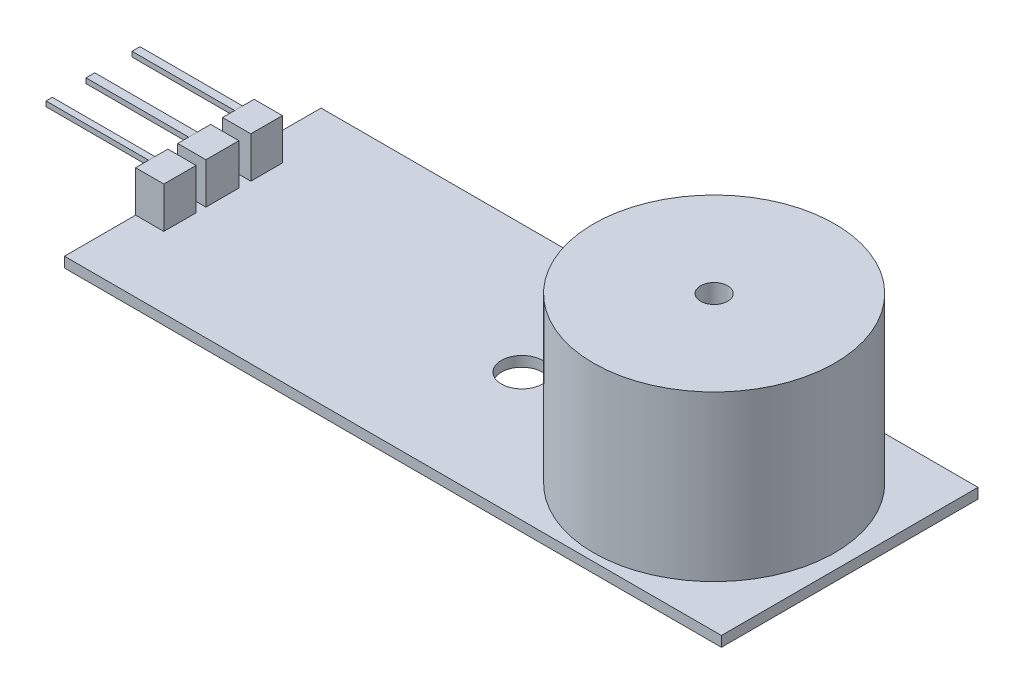
ISO-10303-21;
HEADER;
FILE_DESCRIPTION(('STEP AP214'),'2;1');
FILE_NAME('part.step','',(''),(''),'','','');
FILE_SCHEMA(('AUTOMOTIVE_DESIGN { 1 0 10303 214 1 1 1 1 }'));
ENDSEC;
DATA;
#1=APPLICATION_CONTEXT('core data for automotive mechanical design processes');
#2=APPLICATION_PROTOCOL_DEFINITION('international standard','automotive_design',2000,#1);
#3=PRODUCT_CONTEXT('',#1,'mechanical');
#4=PRODUCT('Part','Part','',(#3));
#5=PRODUCT_RELATED_PRODUCT_CATEGORY('part','',(#4));
#6=PRODUCT_DEFINITION_FORMATION('','',#4);
#7=PRODUCT_DEFINITION_CONTEXT('part definition',#1,'design');
#8=PRODUCT_DEFINITION('design','',#6,#7);
#9=PRODUCT_DEFINITION_SHAPE('','',#8);
#10=(LENGTH_UNIT() NAMED_UNIT(*) SI_UNIT(.MILLI.,.METRE.));
#11=(NAMED_UNIT(*) PLANE_ANGLE_UNIT() SI_UNIT($,.RADIAN.));
#12=(NAMED_UNIT(*) SI_UNIT($,.STERADIAN.) SOLID_ANGLE_UNIT());
#13=UNCERTAINTY_MEASURE_WITH_UNIT(LENGTH_MEASURE(1.E-05),#10,'distance_accuracy_value','');
#14=(GEOMETRIC_REPRESENTATION_CONTEXT(3) GLOBAL_UNCERTAINTY_ASSIGNED_CONTEXT((#13)) GLOBAL_UNIT_ASSIGNED_CONTEXT((#10,
#11,#12)) REPRESENTATION_CONTEXT('',''));
#15=CARTESIAN_POINT('',(0.,0.,0.));
#16=DIRECTION('',(0.,0.,1.));
#17=DIRECTION('',(1.,0.,0.));
#18=AXIS2_PLACEMENT_3D('',#15,#16,#17);
#19=CARTESIAN_POINT('',(-5.,2.5,-4.40804590340399));
#20=DIRECTION('',(0.,0.,1.));
#21=DIRECTION('',(1.,0.,0.));
#22=AXIS2_PLACEMENT_3D('',#19,#20,#21);
#23=PLANE('',#22);
#24=DIRECTION('',(0.,-1.,0.));
#25=VECTOR('',#24,1.);
#26=CARTESIAN_POINT('',(0.,2.5,-4.40804590340399));
#27=LINE('',#26,#25);
#28=CARTESIAN_POINT('',(0.,2.5,-4.40804590340399));
#29=VERTEX_POINT('',#28);
#30=CARTESIAN_POINT('',(0.,2.25454972868777,-4.40804590340399));
#31=VERTEX_POINT('',#30);
#32=EDGE_CURVE('E108',#29,#31,#27,.T.);
#33=ORIENTED_EDGE('',*,*,#32,.T.);
#34=DIRECTION('',(1.,0.,0.));
#35=VECTOR('',#34,1.);
#36=CARTESIAN_POINT('',(-5.,2.25454972868777,-4.40804590340399));
#37=LINE('',#36,#35);
#38=CARTESIAN_POINT('',(-5.,2.25454972868777,-4.40804590340399));
#39=VERTEX_POINT('',#38);
#40=EDGE_CURVE('E12',#39,#31,#37,.T.);
#41=ORIENTED_EDGE('',*,*,#40,.F.);
#42=DIRECTION('',(0.,-1.,0.));
#43=VECTOR('',#42,1.);
#44=CARTESIAN_POINT('',(-5.,2.5,-4.40804590340399));
#45=LINE('',#44,#43);
#46=CARTESIAN_POINT('',(-5.,2.5,-4.40804590340399));
#47=VERTEX_POINT('',#46);
#48=EDGE_CURVE('E96',#47,#39,#45,.T.);
#49=ORIENTED_EDGE('',*,*,#48,.F.);
#50=DIRECTION('',(1.,0.,0.));
#51=VECTOR('',#50,1.);
#52=CARTESIAN_POINT('',(-5.,2.5,-4.40804590340399));
#53=LINE('',#52,#51);
#54=EDGE_CURVE('E104',#47,#29,#53,.T.);
#55=ORIENTED_EDGE('',*,*,#54,.T.);
#56=EDGE_LOOP('',(#33,#41,#49,#55));
#57=FACE_BOUND('',#56,.T.);
#58=ADVANCED_FACE('F45',(#57),#23,.F.);
#59=CARTESIAN_POINT('',(-5.,2.25454972868777,-4.40804590340399));
#60=DIRECTION('',(0.,1.,0.));
#61=DIRECTION('',(0.,0.,1.));
#62=AXIS2_PLACEMENT_3D('',#59,#60,#61);
#63=PLANE('',#62);
#64=DIRECTION('',(0.,0.,1.));
#65=VECTOR('',#64,1.);
#66=CARTESIAN_POINT('',(0.,2.25454972868777,-4.40804590340399));
#67=LINE('',#66,#65);
#68=CARTESIAN_POINT('',(0.,2.25454972868777,-4.10105355397133));
#69=VERTEX_POINT('',#68);
#70=EDGE_CURVE('E100',#31,#69,#67,.T.);
#71=ORIENTED_EDGE('',*,*,#70,.T.);
#72=DIRECTION('',(1.,0.,0.));
#73=VECTOR('',#72,1.);
#74=CARTESIAN_POINT('',(-5.,2.25454972868777,-4.10105355397133));
#75=LINE('',#74,#73);
#76=CARTESIAN_POINT('',(-5.,2.25454972868777,-4.10105355397133));
#77=VERTEX_POINT('',#76);
#78=EDGE_CURVE('E53',#77,#69,#75,.T.);
#79=ORIENTED_EDGE('',*,*,#78,.F.);
#80=DIRECTION('',(0.,0.,1.));
#81=VECTOR('',#80,1.);
#82=CARTESIAN_POINT('',(-5.,2.25454972868777,-4.40804590340399));
#83=LINE('',#82,#81);
#84=EDGE_CURVE('E91',#39,#77,#83,.T.);
#85=ORIENTED_EDGE('',*,*,#84,.F.);
#86=ORIENTED_EDGE('',*,*,#40,.T.);
#87=EDGE_LOOP('',(#71,#79,#85,#86));
#88=FACE_BOUND('',#87,.T.);
#89=ADVANCED_FACE('F99',(#88),#63,.F.);
#90=CARTESIAN_POINT('',(-5.,2.5,-4.10105355397133));
#91=DIRECTION('',(0.,0.,-1.));
#92=DIRECTION('',(-1.,0.,0.));
#93=AXIS2_PLACEMENT_3D('',#90,#91,#92);
#94=PLANE('',#93);
#95=DIRECTION('',(0.,1.,0.));
#96=VECTOR('',#95,1.);
#97=CARTESIAN_POINT('',(0.,2.5,-4.10105355397133));
#98=LINE('',#97,#96);
#99=CARTESIAN_POINT('',(0.,2.5,-4.10105355397133));
#100=VERTEX_POINT('',#99);
#101=EDGE_CURVE('E78',#69,#100,#98,.T.);
#102=ORIENTED_EDGE('',*,*,#101,.T.);
#103=DIRECTION('',(1.,0.,0.));
#104=VECTOR('',#103,1.);
#105=CARTESIAN_POINT('',(-5.,2.5,-4.10105355397133));
#106=LINE('',#105,#104);
#107=CARTESIAN_POINT('',(-5.,2.5,-4.10105355397133));
#108=VERTEX_POINT('',#107);
#109=EDGE_CURVE('E101',#108,#100,#106,.T.);
#110=ORIENTED_EDGE('',*,*,#109,.F.);
#111=DIRECTION('',(0.,1.,0.));
#112=VECTOR('',#111,1.);
#113=CARTESIAN_POINT('',(-5.,2.5,-4.10105355397133));
#114=LINE('',#113,#112);
#115=EDGE_CURVE('E94',#77,#108,#114,.T.);
#116=ORIENTED_EDGE('',*,*,#115,.F.);
#117=ORIENTED_EDGE('',*,*,#78,.T.);
#118=EDGE_LOOP('',(#102,#110,#116,#117));
#119=FACE_BOUND('',#118,.T.);
#120=ADVANCED_FACE('F102',(#119),#94,.F.);
#121=CARTESIAN_POINT('',(-5.,2.5,-4.40804590340399));
#122=DIRECTION('',(0.,-1.,0.));
#123=DIRECTION('',(0.,0.,-1.));
#124=AXIS2_PLACEMENT_3D('',#121,#122,#123);
#125=PLANE('',#124);
#126=DIRECTION('',(0.,0.,-1.));
#127=VECTOR('',#126,1.);
#128=CARTESIAN_POINT('',(0.,2.5,-4.40804590340399));
#129=LINE('',#128,#127);
#130=EDGE_CURVE('E84',#100,#29,#129,.T.);
#131=ORIENTED_EDGE('',*,*,#130,.T.);
#132=ORIENTED_EDGE('',*,*,#54,.F.);
#133=DIRECTION('',(0.,0.,-1.));
#134=VECTOR('',#133,1.);
#135=CARTESIAN_POINT('',(-5.,2.5,-4.40804590340399));
#136=LINE('',#135,#134);
#137=EDGE_CURVE('E61',#108,#47,#136,.T.);
#138=ORIENTED_EDGE('',*,*,#137,.F.);
#139=ORIENTED_EDGE('',*,*,#109,.T.);
#140=EDGE_LOOP('',(#131,#132,#138,#139));
#141=FACE_BOUND('',#140,.T.);
#142=ADVANCED_FACE('F115',(#141),#125,.F.);
#143=CARTESIAN_POINT('',(-5.,0.,0.));
#144=DIRECTION('',(-1.,0.,0.));
#145=DIRECTION('',(0.,0.,1.));
#146=AXIS2_PLACEMENT_3D('',#143,#144,#145);
#147=PLANE('',#146);
#148=ORIENTED_EDGE('',*,*,#48,.T.);
#149=ORIENTED_EDGE('',*,*,#84,.T.);
#150=ORIENTED_EDGE('',*,*,#115,.T.);
#151=ORIENTED_EDGE('',*,*,#137,.T.);
#152=EDGE_LOOP('',(#148,#149,#150,#151));
#153=FACE_BOUND('',#152,.T.);
#154=ADVANCED_FACE('F92',(#153),#147,.T.);
#155=CARTESIAN_POINT('',(0.,0.,0.));
#156=DIRECTION('',(-1.,0.,0.));
#157=DIRECTION('',(0.,0.,1.));
#158=AXIS2_PLACEMENT_3D('',#155,#156,#157);
#159=PLANE('',#158);
#160=ORIENTED_EDGE('',*,*,#32,.F.);
#161=ORIENTED_EDGE('',*,*,#130,.F.);
#162=ORIENTED_EDGE('',*,*,#101,.F.);
#163=ORIENTED_EDGE('',*,*,#70,.F.);
#164=EDGE_LOOP('',(#160,#161,#162,#163));
#165=FACE_BOUND('',#164,.T.);
#166=ADVANCED_FACE('F118',(#165),#159,.F.);
#167=CLOSED_SHELL('',(#58,#89,#120,#142,#154,#166));
#168=MANIFOLD_SOLID_BREP('B2',#167);
#169=CARTESIAN_POINT('',(-5.,2.5,-6.4769073887111));
#170=DIRECTION('',(0.,0.,1.));
#171=DIRECTION('',(1.,0.,0.));
#172=AXIS2_PLACEMENT_3D('',#169,#170,#171);
#173=PLANE('',#172);
#174=DIRECTION('',(0.,-1.,0.));
#175=VECTOR('',#174,1.);
#176=CARTESIAN_POINT('',(0.,2.5,-6.4769073887111));
#177=LINE('',#176,#175);
#178=CARTESIAN_POINT('',(0.,2.5,-6.4769073887111));
#179=VERTEX_POINT('',#178);
#180=CARTESIAN_POINT('',(0.,2.25454972868777,-6.4769073887111));
#181=VERTEX_POINT('',#180);
#182=EDGE_CURVE('E241',#179,#181,#177,.T.);
#183=ORIENTED_EDGE('',*,*,#182,.T.);
#184=DIRECTION('',(1.,0.,0.));
#185=VECTOR('',#184,1.);
#186=CARTESIAN_POINT('',(-5.,2.25454972868777,-6.4769073887111));
#187=LINE('',#186,#185);
#188=CARTESIAN_POINT('',(-5.,2.25454972868777,-6.4769073887111));
#189=VERTEX_POINT('',#188);
#190=EDGE_CURVE('E43',#189,#181,#187,.T.);
#191=ORIENTED_EDGE('',*,*,#190,.F.);
#192=DIRECTION('',(0.,-1.,0.));
#193=VECTOR('',#192,1.);
#194=CARTESIAN_POINT('',(-5.,2.5,-6.4769073887111));
#195=LINE('',#194,#193);
#196=CARTESIAN_POINT('',(-5.,2.5,-6.4769073887111));
#197=VERTEX_POINT('',#196);
#198=EDGE_CURVE('E229',#197,#189,#195,.T.);
#199=ORIENTED_EDGE('',*,*,#198,.F.);
#200=DIRECTION('',(1.,0.,0.));
#201=VECTOR('',#200,1.);
#202=CARTESIAN_POINT('',(-5.,2.5,-6.4769073887111));
#203=LINE('',#202,#201);
#204=EDGE_CURVE('E237',#197,#179,#203,.T.);
#205=ORIENTED_EDGE('',*,*,#204,.T.);
#206=EDGE_LOOP('',(#183,#191,#199,#205));
#207=FACE_BOUND('',#206,.T.);
#208=ADVANCED_FACE('F178',(#207),#173,.F.);
#209=CARTESIAN_POINT('',(-5.,2.25454972868777,-6.4769073887111));
#210=DIRECTION('',(0.,1.,0.));
#211=DIRECTION('',(0.,0.,1.));
#212=AXIS2_PLACEMENT_3D('',#209,#210,#211);
#213=PLANE('',#212);
#214=DIRECTION('',(0.,0.,1.));
#215=VECTOR('',#214,1.);
#216=CARTESIAN_POINT('',(0.,2.25454972868777,-6.4769073887111));
#217=LINE('',#216,#215);
#218=CARTESIAN_POINT('',(0.,2.25454972868777,-6.04978759819609));
#219=VERTEX_POINT('',#218);
#220=EDGE_CURVE('E233',#181,#219,#217,.T.);
#221=ORIENTED_EDGE('',*,*,#220,.T.);
#222=DIRECTION('',(1.,0.,0.));
#223=VECTOR('',#222,1.);
#224=CARTESIAN_POINT('',(-5.,2.25454972868777,-6.04978759819609));
#225=LINE('',#224,#223);
#226=CARTESIAN_POINT('',(-5.,2.25454972868777,-6.04978759819609));
#227=VERTEX_POINT('',#226);
#228=EDGE_CURVE('E186',#227,#219,#225,.T.);
#229=ORIENTED_EDGE('',*,*,#228,.F.);
#230=DIRECTION('',(0.,0.,1.));
#231=VECTOR('',#230,1.);
#232=CARTESIAN_POINT('',(-5.,2.25454972868777,-6.4769073887111));
#233=LINE('',#232,#231);
#234=EDGE_CURVE('E224',#189,#227,#233,.T.);
#235=ORIENTED_EDGE('',*,*,#234,.F.);
#236=ORIENTED_EDGE('',*,*,#190,.T.);
#237=EDGE_LOOP('',(#221,#229,#235,#236));
#238=FACE_BOUND('',#237,.T.);
#239=ADVANCED_FACE('F232',(#238),#213,.F.);
#240=CARTESIAN_POINT('',(-5.,2.5,-6.04978759819609));
#241=DIRECTION('',(0.,0.,-1.));
#242=DIRECTION('',(-1.,0.,0.));
#243=AXIS2_PLACEMENT_3D('',#240,#241,#242);
#244=PLANE('',#243);
#245=DIRECTION('',(0.,1.,0.));
#246=VECTOR('',#245,1.);
#247=CARTESIAN_POINT('',(0.,2.5,-6.04978759819609));
#248=LINE('',#247,#246);
#249=CARTESIAN_POINT('',(0.,2.5,-6.04978759819609));
#250=VERTEX_POINT('',#249);
#251=EDGE_CURVE('E211',#219,#250,#248,.T.);
#252=ORIENTED_EDGE('',*,*,#251,.T.);
#253=DIRECTION('',(1.,0.,0.));
#254=VECTOR('',#253,1.);
#255=CARTESIAN_POINT('',(-5.,2.5,-6.04978759819609));
#256=LINE('',#255,#254);
#257=CARTESIAN_POINT('',(-5.,2.5,-6.04978759819609));
#258=VERTEX_POINT('',#257);
#259=EDGE_CURVE('E234',#258,#250,#256,.T.);
#260=ORIENTED_EDGE('',*,*,#259,.F.);
#261=DIRECTION('',(0.,1.,0.));
#262=VECTOR('',#261,1.);
#263=CARTESIAN_POINT('',(-5.,2.5,-6.04978759819609));
#264=LINE('',#263,#262);
#265=EDGE_CURVE('E227',#227,#258,#264,.T.);
#266=ORIENTED_EDGE('',*,*,#265,.F.);
#267=ORIENTED_EDGE('',*,*,#228,.T.);
#268=EDGE_LOOP('',(#252,#260,#266,#267));
#269=FACE_BOUND('',#268,.T.);
#270=ADVANCED_FACE('F235',(#269),#244,.F.);
#271=CARTESIAN_POINT('',(-5.,2.5,-6.4769073887111));
#272=DIRECTION('',(0.,-1.,0.));
#273=DIRECTION('',(0.,0.,-1.));
#274=AXIS2_PLACEMENT_3D('',#271,#272,#273);
#275=PLANE('',#274);
#276=DIRECTION('',(0.,0.,-1.));
#277=VECTOR('',#276,1.);
#278=CARTESIAN_POINT('',(0.,2.5,-6.4769073887111));
#279=LINE('',#278,#277);
#280=EDGE_CURVE('E217',#250,#179,#279,.T.);
#281=ORIENTED_EDGE('',*,*,#280,.T.);
#282=ORIENTED_EDGE('',*,*,#204,.F.);
#283=DIRECTION('',(0.,0.,-1.));
#284=VECTOR('',#283,1.);
#285=CARTESIAN_POINT('',(-5.,2.5,-6.4769073887111));
#286=LINE('',#285,#284);
#287=EDGE_CURVE('E194',#258,#197,#286,.T.);
#288=ORIENTED_EDGE('',*,*,#287,.F.);
#289=ORIENTED_EDGE('',*,*,#259,.T.);
#290=EDGE_LOOP('',(#281,#282,#288,#289));
#291=FACE_BOUND('',#290,.T.);
#292=ADVANCED_FACE('F248',(#291),#275,.F.);
#293=CARTESIAN_POINT('',(-5.,0.,0.));
#294=DIRECTION('',(-1.,0.,0.));
#295=DIRECTION('',(0.,0.,1.));
#296=AXIS2_PLACEMENT_3D('',#293,#294,#295);
#297=PLANE('',#296);
#298=ORIENTED_EDGE('',*,*,#198,.T.);
#299=ORIENTED_EDGE('',*,*,#234,.T.);
#300=ORIENTED_EDGE('',*,*,#265,.T.);
#301=ORIENTED_EDGE('',*,*,#287,.T.);
#302=EDGE_LOOP('',(#298,#299,#300,#301));
#303=FACE_BOUND('',#302,.T.);
#304=ADVANCED_FACE('F225',(#303),#297,.T.);
#305=CARTESIAN_POINT('',(0.,0.,0.));
#306=DIRECTION('',(-1.,0.,0.));
#307=DIRECTION('',(0.,0.,1.));
#308=AXIS2_PLACEMENT_3D('',#305,#306,#307);
#309=PLANE('',#308);
#310=ORIENTED_EDGE('',*,*,#182,.F.);
#311=ORIENTED_EDGE('',*,*,#280,.F.);
#312=ORIENTED_EDGE('',*,*,#251,.F.);
#313=ORIENTED_EDGE('',*,*,#220,.F.);
#314=EDGE_LOOP('',(#310,#311,#312,#313));
#315=FACE_BOUND('',#314,.T.);
#316=ADVANCED_FACE('F251',(#315),#309,.F.);
#317=CLOSED_SHELL('',(#208,#239,#270,#292,#304,#316));
#318=MANIFOLD_SOLID_BREP('B6',#317);
#319=CARTESIAN_POINT('',(-5.,2.5,-8.67924380855415));
#320=DIRECTION('',(0.,0.,1.));
#321=DIRECTION('',(1.,0.,0.));
#322=AXIS2_PLACEMENT_3D('',#319,#320,#321);
#323=PLANE('',#322);
#324=DIRECTION('',(0.,-1.,0.));
#325=VECTOR('',#324,1.);
#326=CARTESIAN_POINT('',(0.,2.5,-8.67924380855415));
#327=LINE('',#326,#325);
#328=CARTESIAN_POINT('',(0.,2.5,-8.67924380855415));
#329=VERTEX_POINT('',#328);
#330=CARTESIAN_POINT('',(0.,2.25454972868777,-8.67924380855415));
#331=VERTEX_POINT('',#330);
#332=EDGE_CURVE('E374',#329,#331,#327,.T.);
#333=ORIENTED_EDGE('',*,*,#332,.T.);
#334=DIRECTION('',(1.,0.,0.));
#335=VECTOR('',#334,1.);
#336=CARTESIAN_POINT('',(-5.,2.25454972868777,-8.67924380855415));
#337=LINE('',#336,#335);
#338=CARTESIAN_POINT('',(-5.,2.25454972868777,-8.67924380855415));
#339=VERTEX_POINT('',#338);
#340=EDGE_CURVE('E176',#339,#331,#337,.T.);
#341=ORIENTED_EDGE('',*,*,#340,.F.);
#342=DIRECTION('',(0.,-1.,0.));
#343=VECTOR('',#342,1.);
#344=CARTESIAN_POINT('',(-5.,2.5,-8.67924380855415));
#345=LINE('',#344,#343);
#346=CARTESIAN_POINT('',(-5.,2.5,-8.67924380855415));
#347=VERTEX_POINT('',#346);
#348=EDGE_CURVE('E362',#347,#339,#345,.T.);
#349=ORIENTED_EDGE('',*,*,#348,.F.);
#350=DIRECTION('',(1.,0.,0.));
#351=VECTOR('',#350,1.);
#352=CARTESIAN_POINT('',(-5.,2.5,-8.67924380855415));
#353=LINE('',#352,#351);
#354=EDGE_CURVE('E370',#347,#329,#353,.T.);
#355=ORIENTED_EDGE('',*,*,#354,.T.);
#356=EDGE_LOOP('',(#333,#341,#349,#355));
#357=FACE_BOUND('',#356,.T.);
#358=ADVANCED_FACE('F311',(#357),#323,.F.);
#359=CARTESIAN_POINT('',(-5.,2.25454972868777,-8.67924380855415));
#360=DIRECTION('',(0.,1.,0.));
#361=DIRECTION('',(0.,0.,1.));
#362=AXIS2_PLACEMENT_3D('',#359,#360,#361);
#363=PLANE('',#362);
#364=DIRECTION('',(0.,0.,1.));
#365=VECTOR('',#364,1.);
#366=CARTESIAN_POINT('',(0.,2.25454972868777,-8.67924380855415));
#367=LINE('',#366,#365);
#368=CARTESIAN_POINT('',(0.,2.25454972868777,-8.29216649839992));
#369=VERTEX_POINT('',#368);
#370=EDGE_CURVE('E366',#331,#369,#367,.T.);
#371=ORIENTED_EDGE('',*,*,#370,.T.);
#372=DIRECTION('',(1.,0.,0.));
#373=VECTOR('',#372,1.);
#374=CARTESIAN_POINT('',(-5.,2.25454972868777,-8.29216649839992));
#375=LINE('',#374,#373);
#376=CARTESIAN_POINT('',(-5.,2.25454972868777,-8.29216649839992));
#377=VERTEX_POINT('',#376);
#378=EDGE_CURVE('E319',#377,#369,#375,.T.);
#379=ORIENTED_EDGE('',*,*,#378,.F.);
#380=DIRECTION('',(0.,0.,1.));
#381=VECTOR('',#380,1.);
#382=CARTESIAN_POINT('',(-5.,2.25454972868777,-8.67924380855415));
#383=LINE('',#382,#381);
#384=EDGE_CURVE('E357',#339,#377,#383,.T.);
#385=ORIENTED_EDGE('',*,*,#384,.F.);
#386=ORIENTED_EDGE('',*,*,#340,.T.);
#387=EDGE_LOOP('',(#371,#379,#385,#386));
#388=FACE_BOUND('',#387,.T.);
#389=ADVANCED_FACE('F365',(#388),#363,.F.);
#390=CARTESIAN_POINT('',(-5.,2.5,-8.29216649839992));
#391=DIRECTION('',(0.,0.,-1.));
#392=DIRECTION('',(-1.,0.,0.));
#393=AXIS2_PLACEMENT_3D('',#390,#391,#392);
#394=PLANE('',#393);
#395=DIRECTION('',(0.,1.,0.));
#396=VECTOR('',#395,1.);
#397=CARTESIAN_POINT('',(0.,2.5,-8.29216649839992));
#398=LINE('',#397,#396);
#399=CARTESIAN_POINT('',(0.,2.5,-8.29216649839992));
#400=VERTEX_POINT('',#399);
#401=EDGE_CURVE('E344',#369,#400,#398,.T.);
#402=ORIENTED_EDGE('',*,*,#401,.T.);
#403=DIRECTION('',(1.,0.,0.));
#404=VECTOR('',#403,1.);
#405=CARTESIAN_POINT('',(-5.,2.5,-8.29216649839992));
#406=LINE('',#405,#404);
#407=CARTESIAN_POINT('',(-5.,2.5,-8.29216649839992));
#408=VERTEX_POINT('',#407);
#409=EDGE_CURVE('E367',#408,#400,#406,.T.);
#410=ORIENTED_EDGE('',*,*,#409,.F.);
#411=DIRECTION('',(0.,1.,0.));
#412=VECTOR('',#411,1.);
#413=CARTESIAN_POINT('',(-5.,2.5,-8.29216649839992));
#414=LINE('',#413,#412);
#415=EDGE_CURVE('E360',#377,#408,#414,.T.);
#416=ORIENTED_EDGE('',*,*,#415,.F.);
#417=ORIENTED_EDGE('',*,*,#378,.T.);
#418=EDGE_LOOP('',(#402,#410,#416,#417));
#419=FACE_BOUND('',#418,.T.);
#420=ADVANCED_FACE('F368',(#419),#394,.F.);
#421=CARTESIAN_POINT('',(-5.,2.5,-8.67924380855415));
#422=DIRECTION('',(0.,-1.,0.));
#423=DIRECTION('',(0.,0.,-1.));
#424=AXIS2_PLACEMENT_3D('',#421,#422,#423);
#425=PLANE('',#424);
#426=DIRECTION('',(0.,0.,-1.));
#427=VECTOR('',#426,1.);
#428=CARTESIAN_POINT('',(0.,2.5,-8.67924380855415));
#429=LINE('',#428,#427);
#430=EDGE_CURVE('E350',#400,#329,#429,.T.);
#431=ORIENTED_EDGE('',*,*,#430,.T.);
#432=ORIENTED_EDGE('',*,*,#354,.F.);
#433=DIRECTION('',(0.,0.,-1.));
#434=VECTOR('',#433,1.);
#435=CARTESIAN_POINT('',(-5.,2.5,-8.67924380855415));
#436=LINE('',#435,#434);
#437=EDGE_CURVE('E327',#408,#347,#436,.T.);
#438=ORIENTED_EDGE('',*,*,#437,.F.);
#439=ORIENTED_EDGE('',*,*,#409,.T.);
#440=EDGE_LOOP('',(#431,#432,#438,#439));
#441=FACE_BOUND('',#440,.T.);
#442=ADVANCED_FACE('F381',(#441),#425,.F.);
#443=CARTESIAN_POINT('',(-5.,0.,0.));
#444=DIRECTION('',(-1.,0.,0.));
#445=DIRECTION('',(0.,0.,1.));
#446=AXIS2_PLACEMENT_3D('',#443,#444,#445);
#447=PLANE('',#446);
#448=ORIENTED_EDGE('',*,*,#348,.T.);
#449=ORIENTED_EDGE('',*,*,#384,.T.);
#450=ORIENTED_EDGE('',*,*,#415,.T.);
#451=ORIENTED_EDGE('',*,*,#437,.T.);
#452=EDGE_LOOP('',(#448,#449,#450,#451));
#453=FACE_BOUND('',#452,.T.);
#454=ADVANCED_FACE('F358',(#453),#447,.T.);
#455=CARTESIAN_POINT('',(0.,0.,0.));
#456=DIRECTION('',(-1.,0.,0.));
#457=DIRECTION('',(0.,0.,1.));
#458=AXIS2_PLACEMENT_3D('',#455,#456,#457);
#459=PLANE('',#458);
#460=ORIENTED_EDGE('',*,*,#332,.F.);
#461=ORIENTED_EDGE('',*,*,#430,.F.);
#462=ORIENTED_EDGE('',*,*,#401,.F.);
#463=ORIENTED_EDGE('',*,*,#370,.F.);
#464=EDGE_LOOP('',(#460,#461,#462,#463));
#465=FACE_BOUND('',#464,.T.);
#466=ADVANCED_FACE('F384',(#465),#459,.F.);
#467=CLOSED_SHELL('',(#358,#389,#420,#442,#454,#466));
#468=MANIFOLD_SOLID_BREP('B37',#467);
#469=CARTESIAN_POINT('',(0.,2.5,-5.03697979493733));
#470=DIRECTION('',(1.,0.,0.));
#471=DIRECTION('',(0.,0.,-1.));
#472=AXIS2_PLACEMENT_3D('',#469,#470,#471);
#473=PLANE('',#472);
#474=DIRECTION('',(0.,0.,1.));
#475=VECTOR('',#474,1.);
#476=CARTESIAN_POINT('',(0.,0.5,-5.03697979493733));
#477=LINE('',#476,#475);
#478=CARTESIAN_POINT('',(0.,0.5,-5.03697979493733));
#479=VERTEX_POINT('',#478);
#480=CARTESIAN_POINT('',(0.,0.5,-3.46517896584207));
#481=VERTEX_POINT('',#480);
#482=EDGE_CURVE('E507',#479,#481,#477,.T.);
#483=ORIENTED_EDGE('',*,*,#482,.T.);
#484=DIRECTION('',(0.,-1.,0.));
#485=VECTOR('',#484,1.);
#486=CARTESIAN_POINT('',(0.,2.5,-3.46517896584207));
#487=LINE('',#486,#485);
#488=CARTESIAN_POINT('',(0.,2.5,-3.46517896584207));
#489=VERTEX_POINT('',#488);
#490=EDGE_CURVE('E309',#489,#481,#487,.T.);
#491=ORIENTED_EDGE('',*,*,#490,.F.);
#492=DIRECTION('',(0.,0.,1.));
#493=VECTOR('',#492,1.);
#494=CARTESIAN_POINT('',(0.,2.5,-5.03697979493733));
#495=LINE('',#494,#493);
#496=CARTESIAN_POINT('',(0.,2.5,-5.03697979493733));
#497=VERTEX_POINT('',#496);
#498=EDGE_CURVE('E495',#497,#489,#495,.T.);
#499=ORIENTED_EDGE('',*,*,#498,.F.);
#500=DIRECTION('',(0.,-1.,0.));
#501=VECTOR('',#500,1.);
#502=CARTESIAN_POINT('',(0.,2.5,-5.03697979493733));
#503=LINE('',#502,#501);
#504=EDGE_CURVE('E503',#497,#479,#503,.T.);
#505=ORIENTED_EDGE('',*,*,#504,.T.);
#506=EDGE_LOOP('',(#483,#491,#499,#505));
#507=FACE_BOUND('',#506,.T.);
#508=ADVANCED_FACE('F444',(#507),#473,.F.);
#509=CARTESIAN_POINT('',(0.,2.5,-3.46517896584207));
#510=DIRECTION('',(0.,0.,-1.));
#511=DIRECTION('',(-1.,0.,0.));
#512=AXIS2_PLACEMENT_3D('',#509,#510,#511);
#513=PLANE('',#512);
#514=DIRECTION('',(1.,0.,0.));
#515=VECTOR('',#514,1.);
#516=CARTESIAN_POINT('',(0.,0.5,-3.46517896584207));
#517=LINE('',#516,#515);
#518=CARTESIAN_POINT('',(1.37541837276585,0.5,-3.46517896584207));
#519=VERTEX_POINT('',#518);
#520=EDGE_CURVE('E499',#481,#519,#517,.T.);
#521=ORIENTED_EDGE('',*,*,#520,.T.);
#522=DIRECTION('',(0.,-1.,0.));
#523=VECTOR('',#522,1.);
#524=CARTESIAN_POINT('',(1.37541837276585,2.5,-3.46517896584207));
#525=LINE('',#524,#523);
#526=CARTESIAN_POINT('',(1.37541837276585,2.5,-3.46517896584207));
#527=VERTEX_POINT('',#526);
#528=EDGE_CURVE('E452',#527,#519,#525,.T.);
#529=ORIENTED_EDGE('',*,*,#528,.F.);
#530=DIRECTION('',(1.,0.,0.));
#531=VECTOR('',#530,1.);
#532=CARTESIAN_POINT('',(0.,2.5,-3.46517896584207));
#533=LINE('',#532,#531);
#534=EDGE_CURVE('E490',#489,#527,#533,.T.);
#535=ORIENTED_EDGE('',*,*,#534,.F.);
#536=ORIENTED_EDGE('',*,*,#490,.T.);
#537=EDGE_LOOP('',(#521,#529,#535,#536));
#538=FACE_BOUND('',#537,.T.);
#539=ADVANCED_FACE('F498',(#538),#513,.F.);
#540=CARTESIAN_POINT('',(1.37541837276585,2.5,-5.03697979493733));
#541=DIRECTION('',(-1.,0.,0.));
#542=DIRECTION('',(0.,0.,1.));
#543=AXIS2_PLACEMENT_3D('',#540,#541,#542);
#544=PLANE('',#543);
#545=DIRECTION('',(0.,0.,-1.));
#546=VECTOR('',#545,1.);
#547=CARTESIAN_POINT('',(1.37541837276585,0.5,-5.03697979493733));
#548=LINE('',#547,#546);
#549=CARTESIAN_POINT('',(1.37541837276585,0.5,-5.03697979493733));
#550=VERTEX_POINT('',#549);
#551=EDGE_CURVE('E477',#519,#550,#548,.T.);
#552=ORIENTED_EDGE('',*,*,#551,.T.);
#553=DIRECTION('',(0.,-1.,0.));
#554=VECTOR('',#553,1.);
#555=CARTESIAN_POINT('',(1.37541837276585,2.5,-5.03697979493733));
#556=LINE('',#555,#554);
#557=CARTESIAN_POINT('',(1.37541837276585,2.5,-5.03697979493733));
#558=VERTEX_POINT('',#557);
#559=EDGE_CURVE('E500',#558,#550,#556,.T.);
#560=ORIENTED_EDGE('',*,*,#559,.F.);
#561=DIRECTION('',(0.,0.,-1.));
#562=VECTOR('',#561,1.);
#563=CARTESIAN_POINT('',(1.37541837276585,2.5,-5.03697979493733));
#564=LINE('',#563,#562);
#565=EDGE_CURVE('E493',#527,#558,#564,.T.);
#566=ORIENTED_EDGE('',*,*,#565,.F.);
#567=ORIENTED_EDGE('',*,*,#528,.T.);
#568=EDGE_LOOP('',(#552,#560,#566,#567));
#569=FACE_BOUND('',#568,.T.);
#570=ADVANCED_FACE('F501',(#569),#544,.F.);
#571=CARTESIAN_POINT('',(0.,2.5,-5.03697979493733));
#572=DIRECTION('',(0.,0.,1.));
#573=DIRECTION('',(1.,0.,0.));
#574=AXIS2_PLACEMENT_3D('',#571,#572,#573);
#575=PLANE('',#574);
#576=DIRECTION('',(-1.,0.,0.));
#577=VECTOR('',#576,1.);
#578=CARTESIAN_POINT('',(0.,0.5,-5.03697979493733));
#579=LINE('',#578,#577);
#580=EDGE_CURVE('E483',#550,#479,#579,.T.);
#581=ORIENTED_EDGE('',*,*,#580,.T.);
#582=ORIENTED_EDGE('',*,*,#504,.F.);
#583=DIRECTION('',(-1.,0.,0.));
#584=VECTOR('',#583,1.);
#585=CARTESIAN_POINT('',(0.,2.5,-5.03697979493733));
#586=LINE('',#585,#584);
#587=EDGE_CURVE('E460',#558,#497,#586,.T.);
#588=ORIENTED_EDGE('',*,*,#587,.F.);
#589=ORIENTED_EDGE('',*,*,#559,.T.);
#590=EDGE_LOOP('',(#581,#582,#588,#589));
#591=FACE_BOUND('',#590,.T.);
#592=ADVANCED_FACE('F514',(#591),#575,.F.);
#593=CARTESIAN_POINT('',(0.,2.5,0.));
#594=DIRECTION('',(0.,1.,0.));
#595=DIRECTION('',(0.,0.,1.));
#596=AXIS2_PLACEMENT_3D('',#593,#594,#595);
#597=PLANE('',#596);
#598=ORIENTED_EDGE('',*,*,#498,.T.);
#599=ORIENTED_EDGE('',*,*,#534,.T.);
#600=ORIENTED_EDGE('',*,*,#565,.T.);
#601=ORIENTED_EDGE('',*,*,#587,.T.);
#602=EDGE_LOOP('',(#598,#599,#600,#601));
#603=FACE_BOUND('',#602,.T.);
#604=ADVANCED_FACE('F491',(#603),#597,.T.);
#605=CARTESIAN_POINT('',(0.,0.5,0.));
#606=DIRECTION('',(0.,1.,0.));
#607=DIRECTION('',(0.,0.,1.));
#608=AXIS2_PLACEMENT_3D('',#605,#606,#607);
#609=PLANE('',#608);
#610=ORIENTED_EDGE('',*,*,#482,.F.);
#611=ORIENTED_EDGE('',*,*,#580,.F.);
#612=ORIENTED_EDGE('',*,*,#551,.F.);
#613=ORIENTED_EDGE('',*,*,#520,.F.);
#614=EDGE_LOOP('',(#610,#611,#612,#613));
#615=FACE_BOUND('',#614,.T.);
#616=ADVANCED_FACE('F517',(#615),#609,.F.);
#617=CLOSED_SHELL('',(#508,#539,#570,#592,#604,#616));
#618=MANIFOLD_SOLID_BREP('B170',#617);
#619=CARTESIAN_POINT('',(0.,2.5,-7.70220728775103));
#620=DIRECTION('',(1.,0.,0.));
#621=DIRECTION('',(0.,0.,-1.));
#622=AXIS2_PLACEMENT_3D('',#619,#620,#621);
#623=PLANE('',#622);
#624=DIRECTION('',(0.,0.,1.));
#625=VECTOR('',#624,1.);
#626=CARTESIAN_POINT('',(0.,0.5,-7.70220728775103));
#627=LINE('',#626,#625);
#628=CARTESIAN_POINT('',(0.,0.5,-9.23983853360509));
#629=VERTEX_POINT('',#628);
#630=CARTESIAN_POINT('',(0.,0.5,-7.70220728775103));
#631=VERTEX_POINT('',#630);
#632=EDGE_CURVE('E640',#629,#631,#627,.T.);
#633=ORIENTED_EDGE('',*,*,#632,.T.);
#634=DIRECTION('',(0.,-1.,0.));
#635=VECTOR('',#634,1.);
#636=CARTESIAN_POINT('',(0.,2.5,-7.70220728775103));
#637=LINE('',#636,#635);
#638=CARTESIAN_POINT('',(0.,2.5,-7.70220728775103));
#639=VERTEX_POINT('',#638);
#640=EDGE_CURVE('E442',#639,#631,#637,.T.);
#641=ORIENTED_EDGE('',*,*,#640,.F.);
#642=DIRECTION('',(0.,0.,1.));
#643=VECTOR('',#642,1.);
#644=CARTESIAN_POINT('',(0.,2.5,-7.70220728775103));
#645=LINE('',#644,#643);
#646=CARTESIAN_POINT('',(0.,2.5,-9.23983853360509));
#647=VERTEX_POINT('',#646);
#648=EDGE_CURVE('E628',#647,#639,#645,.T.);
#649=ORIENTED_EDGE('',*,*,#648,.F.);
#650=DIRECTION('',(0.,-1.,0.));
#651=VECTOR('',#650,1.);
#652=CARTESIAN_POINT('',(0.,2.5,-9.23983853360509));
#653=LINE('',#652,#651);
#654=EDGE_CURVE('E636',#647,#629,#653,.T.);
#655=ORIENTED_EDGE('',*,*,#654,.T.);
#656=EDGE_LOOP('',(#633,#641,#649,#655));
#657=FACE_BOUND('',#656,.T.);
#658=ADVANCED_FACE('F577',(#657),#623,.F.);
#659=CARTESIAN_POINT('',(0.,2.5,-7.70220728775103));
#660=DIRECTION('',(0.,0.,-1.));
#661=DIRECTION('',(-1.,0.,0.));
#662=AXIS2_PLACEMENT_3D('',#659,#660,#661);
#663=PLANE('',#662);
#664=DIRECTION('',(1.,0.,0.));
#665=VECTOR('',#664,1.);
#666=CARTESIAN_POINT('',(0.,0.5,-7.70220728775103));
#667=LINE('',#666,#665);
#668=CARTESIAN_POINT('',(1.37541837276585,0.5,-7.70220728775103));
#669=VERTEX_POINT('',#668);
#670=EDGE_CURVE('E632',#631,#669,#667,.T.);
#671=ORIENTED_EDGE('',*,*,#670,.T.);
#672=DIRECTION('',(0.,-1.,0.));
#673=VECTOR('',#672,1.);
#674=CARTESIAN_POINT('',(1.37541837276585,2.5,-7.70220728775103));
#675=LINE('',#674,#673);
#676=CARTESIAN_POINT('',(1.37541837276585,2.5,-7.70220728775103));
#677=VERTEX_POINT('',#676);
#678=EDGE_CURVE('E585',#677,#669,#675,.T.);
#679=ORIENTED_EDGE('',*,*,#678,.F.);
#680=DIRECTION('',(1.,0.,0.));
#681=VECTOR('',#680,1.);
#682=CARTESIAN_POINT('',(0.,2.5,-7.70220728775103));
#683=LINE('',#682,#681);
#684=EDGE_CURVE('E623',#639,#677,#683,.T.);
#685=ORIENTED_EDGE('',*,*,#684,.F.);
#686=ORIENTED_EDGE('',*,*,#640,.T.);
#687=EDGE_LOOP('',(#671,#679,#685,#686));
#688=FACE_BOUND('',#687,.T.);
#689=ADVANCED_FACE('F631',(#688),#663,.F.);
#690=CARTESIAN_POINT('',(1.37541837276585,2.5,-7.70220728775103));
#691=DIRECTION('',(-1.,0.,0.));
#692=DIRECTION('',(0.,0.,1.));
#693=AXIS2_PLACEMENT_3D('',#690,#691,#692);
#694=PLANE('',#693);
#695=DIRECTION('',(0.,0.,-1.));
#696=VECTOR('',#695,1.);
#697=CARTESIAN_POINT('',(1.37541837276585,0.5,-7.70220728775103));
#698=LINE('',#697,#696);
#699=CARTESIAN_POINT('',(1.37541837276585,0.5,-9.23983853360509));
#700=VERTEX_POINT('',#699);
#701=EDGE_CURVE('E610',#669,#700,#698,.T.);
#702=ORIENTED_EDGE('',*,*,#701,.T.);
#703=DIRECTION('',(0.,-1.,0.));
#704=VECTOR('',#703,1.);
#705=CARTESIAN_POINT('',(1.37541837276585,2.5,-9.23983853360509));
#706=LINE('',#705,#704);
#707=CARTESIAN_POINT('',(1.37541837276585,2.5,-9.23983853360509));
#708=VERTEX_POINT('',#707);
#709=EDGE_CURVE('E633',#708,#700,#706,.T.);
#710=ORIENTED_EDGE('',*,*,#709,.F.);
#711=DIRECTION('',(0.,0.,-1.));
#712=VECTOR('',#711,1.);
#713=CARTESIAN_POINT('',(1.37541837276585,2.5,-7.70220728775103));
#714=LINE('',#713,#712);
#715=EDGE_CURVE('E626',#677,#708,#714,.T.);
#716=ORIENTED_EDGE('',*,*,#715,.F.);
#717=ORIENTED_EDGE('',*,*,#678,.T.);
#718=EDGE_LOOP('',(#702,#710,#716,#717));
#719=FACE_BOUND('',#718,.T.);
#720=ADVANCED_FACE('F634',(#719),#694,.F.);
#721=CARTESIAN_POINT('',(0.,2.5,-9.23983853360509));
#722=DIRECTION('',(0.,0.,1.));
#723=DIRECTION('',(1.,0.,0.));
#724=AXIS2_PLACEMENT_3D('',#721,#722,#723);
#725=PLANE('',#724);
#726=DIRECTION('',(-1.,0.,0.));
#727=VECTOR('',#726,1.);
#728=CARTESIAN_POINT('',(0.,0.5,-9.23983853360509));
#729=LINE('',#728,#727);
#730=EDGE_CURVE('E616',#700,#629,#729,.T.);
#731=ORIENTED_EDGE('',*,*,#730,.T.);
#732=ORIENTED_EDGE('',*,*,#654,.F.);
#733=DIRECTION('',(-1.,0.,0.));
#734=VECTOR('',#733,1.);
#735=CARTESIAN_POINT('',(0.,2.5,-9.23983853360509));
#736=LINE('',#735,#734);
#737=EDGE_CURVE('E593',#708,#647,#736,.T.);
#738=ORIENTED_EDGE('',*,*,#737,.F.);
#739=ORIENTED_EDGE('',*,*,#709,.T.);
#740=EDGE_LOOP('',(#731,#732,#738,#739));
#741=FACE_BOUND('',#740,.T.);
#742=ADVANCED_FACE('F647',(#741),#725,.F.);
#743=CARTESIAN_POINT('',(0.,2.5,0.));
#744=DIRECTION('',(0.,-1.,0.));
#745=DIRECTION('',(0.,0.,-1.));
#746=AXIS2_PLACEMENT_3D('',#743,#744,#745);
#747=PLANE('',#746);
#748=ORIENTED_EDGE('',*,*,#648,.T.);
#749=ORIENTED_EDGE('',*,*,#684,.T.);
#750=ORIENTED_EDGE('',*,*,#715,.T.);
#751=ORIENTED_EDGE('',*,*,#737,.T.);
#752=EDGE_LOOP('',(#748,#749,#750,#751));
#753=FACE_BOUND('',#752,.T.);
#754=ADVANCED_FACE('F624',(#753),#747,.F.);
#755=CARTESIAN_POINT('',(0.,0.5,0.));
#756=DIRECTION('',(0.,-1.,0.));
#757=DIRECTION('',(0.,0.,-1.));
#758=AXIS2_PLACEMENT_3D('',#755,#756,#757);
#759=PLANE('',#758);
#760=ORIENTED_EDGE('',*,*,#632,.F.);
#761=ORIENTED_EDGE('',*,*,#730,.F.);
#762=ORIENTED_EDGE('',*,*,#701,.F.);
#763=ORIENTED_EDGE('',*,*,#670,.F.);
#764=EDGE_LOOP('',(#760,#761,#762,#763));
#765=FACE_BOUND('',#764,.T.);
#766=ADVANCED_FACE('F650',(#765),#759,.T.);
#767=CLOSED_SHELL('',(#658,#689,#720,#742,#754,#766));
#768=MANIFOLD_SOLID_BREP('B303',#767);
#769=CARTESIAN_POINT('',(0.,2.5,-7.12132437265061));
#770=DIRECTION('',(1.,0.,0.));
#771=DIRECTION('',(0.,0.,-1.));
#772=AXIS2_PLACEMENT_3D('',#769,#770,#771);
#773=PLANE('',#772);
#774=DIRECTION('',(0.,0.,1.));
#775=VECTOR('',#774,1.);
#776=CARTESIAN_POINT('',(0.,0.5,-7.12132437265061));
#777=LINE('',#776,#775);
#778=CARTESIAN_POINT('',(0.,0.5,-7.12132437265061));
#779=VERTEX_POINT('',#778);
#780=CARTESIAN_POINT('',(0.,0.5,-5.51535396031415));
#781=VERTEX_POINT('',#780);
#782=EDGE_CURVE('E771',#779,#781,#777,.T.);
#783=ORIENTED_EDGE('',*,*,#782,.T.);
#784=DIRECTION('',(0.,-1.,0.));
#785=VECTOR('',#784,1.);
#786=CARTESIAN_POINT('',(0.,2.5,-5.51535396031415));
#787=LINE('',#786,#785);
#788=CARTESIAN_POINT('',(0.,2.5,-5.51535396031415));
#789=VERTEX_POINT('',#788);
#790=EDGE_CURVE('E575',#789,#781,#787,.T.);
#791=ORIENTED_EDGE('',*,*,#790,.F.);
#792=DIRECTION('',(0.,0.,1.));
#793=VECTOR('',#792,1.);
#794=CARTESIAN_POINT('',(0.,2.5,-7.12132437265061));
#795=LINE('',#794,#793);
#796=CARTESIAN_POINT('',(0.,2.5,-7.12132437265061));
#797=VERTEX_POINT('',#796);
#798=EDGE_CURVE('E759',#797,#789,#795,.T.);
#799=ORIENTED_EDGE('',*,*,#798,.F.);
#800=DIRECTION('',(0.,-1.,0.));
#801=VECTOR('',#800,1.);
#802=CARTESIAN_POINT('',(0.,2.5,-7.12132437265061));
#803=LINE('',#802,#801);
#804=EDGE_CURVE('E767',#797,#779,#803,.T.);
#805=ORIENTED_EDGE('',*,*,#804,.T.);
#806=EDGE_LOOP('',(#783,#791,#799,#805));
#807=FACE_BOUND('',#806,.T.);
#808=ADVANCED_FACE('F708',(#807),#773,.F.);
#809=CARTESIAN_POINT('',(0.,2.5,-5.51535396031415));
#810=DIRECTION('',(0.,0.,-1.));
#811=DIRECTION('',(-1.,0.,0.));
#812=AXIS2_PLACEMENT_3D('',#809,#810,#811);
#813=PLANE('',#812);
#814=DIRECTION('',(1.,0.,0.));
#815=VECTOR('',#814,1.);
#816=CARTESIAN_POINT('',(0.,0.5,-5.51535396031415));
#817=LINE('',#816,#815);
#818=CARTESIAN_POINT('',(1.37541837276585,0.5,-5.51535396031415));
#819=VERTEX_POINT('',#818);
#820=EDGE_CURVE('E763',#781,#819,#817,.T.);
#821=ORIENTED_EDGE('',*,*,#820,.T.);
#822=DIRECTION('',(0.,-1.,0.));
#823=VECTOR('',#822,1.);
#824=CARTESIAN_POINT('',(1.37541837276585,2.5,-5.51535396031415));
#825=LINE('',#824,#823);
#826=CARTESIAN_POINT('',(1.37541837276585,2.5,-5.51535396031415));
#827=VERTEX_POINT('',#826);
#828=EDGE_CURVE('E716',#827,#819,#825,.T.);
#829=ORIENTED_EDGE('',*,*,#828,.F.);
#830=DIRECTION('',(1.,0.,0.));
#831=VECTOR('',#830,1.);
#832=CARTESIAN_POINT('',(0.,2.5,-5.51535396031415));
#833=LINE('',#832,#831);
#834=EDGE_CURVE('E754',#789,#827,#833,.T.);
#835=ORIENTED_EDGE('',*,*,#834,.F.);
#836=ORIENTED_EDGE('',*,*,#790,.T.);
#837=EDGE_LOOP('',(#821,#829,#835,#836));
#838=FACE_BOUND('',#837,.T.);
#839=ADVANCED_FACE('F762',(#838),#813,.F.);
#840=CARTESIAN_POINT('',(1.37541837276585,2.5,-7.12132437265061));
#841=DIRECTION('',(-1.,0.,0.));
#842=DIRECTION('',(0.,0.,1.));
#843=AXIS2_PLACEMENT_3D('',#840,#841,#842);
#844=PLANE('',#843);
#845=DIRECTION('',(0.,0.,-1.));
#846=VECTOR('',#845,1.);
#847=CARTESIAN_POINT('',(1.37541837276585,0.5,-7.12132437265061));
#848=LINE('',#847,#846);
#849=CARTESIAN_POINT('',(1.37541837276585,0.5,-7.12132437265061));
#850=VERTEX_POINT('',#849);
#851=EDGE_CURVE('E741',#819,#850,#848,.T.);
#852=ORIENTED_EDGE('',*,*,#851,.T.);
#853=DIRECTION('',(0.,-1.,0.));
#854=VECTOR('',#853,1.);
#855=CARTESIAN_POINT('',(1.37541837276585,2.5,-7.12132437265061));
#856=LINE('',#855,#854);
#857=CARTESIAN_POINT('',(1.37541837276585,2.5,-7.12132437265061));
#858=VERTEX_POINT('',#857);
#859=EDGE_CURVE('E764',#858,#850,#856,.T.);
#860=ORIENTED_EDGE('',*,*,#859,.F.);
#861=DIRECTION('',(0.,0.,-1.));
#862=VECTOR('',#861,1.);
#863=CARTESIAN_POINT('',(1.37541837276585,2.5,-7.12132437265061));
#864=LINE('',#863,#862);
#865=EDGE_CURVE('E757',#827,#858,#864,.T.);
#866=ORIENTED_EDGE('',*,*,#865,.F.);
#867=ORIENTED_EDGE('',*,*,#828,.T.);
#868=EDGE_LOOP('',(#852,#860,#866,#867));
#869=FACE_BOUND('',#868,.T.);
#870=ADVANCED_FACE('F765',(#869),#844,.F.);
#871=CARTESIAN_POINT('',(0.,2.5,-7.12132437265061));
#872=DIRECTION('',(0.,0.,1.));
#873=DIRECTION('',(1.,0.,0.));
#874=AXIS2_PLACEMENT_3D('',#871,#872,#873);
#875=PLANE('',#874);
#876=DIRECTION('',(-1.,0.,0.));
#877=VECTOR('',#876,1.);
#878=CARTESIAN_POINT('',(0.,0.5,-7.12132437265061));
#879=LINE('',#878,#877);
#880=EDGE_CURVE('E747',#850,#779,#879,.T.);
#881=ORIENTED_EDGE('',*,*,#880,.T.);
#882=ORIENTED_EDGE('',*,*,#804,.F.);
#883=DIRECTION('',(-1.,0.,0.));
#884=VECTOR('',#883,1.);
#885=CARTESIAN_POINT('',(0.,2.5,-7.12132437265061));
#886=LINE('',#885,#884);
#887=EDGE_CURVE('E724',#858,#797,#886,.T.);
#888=ORIENTED_EDGE('',*,*,#887,.F.);
#889=ORIENTED_EDGE('',*,*,#859,.T.);
#890=EDGE_LOOP('',(#881,#882,#888,#889));
#891=FACE_BOUND('',#890,.T.);
#892=ADVANCED_FACE('F778',(#891),#875,.F.);
#893=CARTESIAN_POINT('',(0.,2.5,0.));
#894=DIRECTION('',(0.,1.,0.));
#895=DIRECTION('',(0.,0.,1.));
#896=AXIS2_PLACEMENT_3D('',#893,#894,#895);
#897=PLANE('',#896);
#898=ORIENTED_EDGE('',*,*,#798,.T.);
#899=ORIENTED_EDGE('',*,*,#834,.T.);
#900=ORIENTED_EDGE('',*,*,#865,.T.);
#901=ORIENTED_EDGE('',*,*,#887,.T.);
#902=EDGE_LOOP('',(#898,#899,#900,#901));
#903=FACE_BOUND('',#902,.T.);
#904=ADVANCED_FACE('F755',(#903),#897,.T.);
#905=CARTESIAN_POINT('',(0.,0.5,0.));
#906=DIRECTION('',(0.,1.,0.));
#907=DIRECTION('',(0.,0.,1.));
#908=AXIS2_PLACEMENT_3D('',#905,#906,#907);
#909=PLANE('',#908);
#910=ORIENTED_EDGE('',*,*,#782,.F.);
#911=ORIENTED_EDGE('',*,*,#880,.F.);
#912=ORIENTED_EDGE('',*,*,#851,.F.);
#913=ORIENTED_EDGE('',*,*,#820,.F.);
#914=EDGE_LOOP('',(#910,#911,#912,#913));
#915=FACE_BOUND('',#914,.T.);
#916=ADVANCED_FACE('F781',(#915),#909,.F.);
#917=CLOSED_SHELL('',(#808,#839,#870,#892,#904,#916));
#918=MANIFOLD_SOLID_BREP('B436',#917);
#919=CARTESIAN_POINT('',(25.3966353913304,8.5,-6.25));
#920=DIRECTION('',(0.,-1.,0.));
#921=DIRECTION('',(0.,0.,-1.));
#922=AXIS2_PLACEMENT_3D('',#919,#920,#921);
#923=CYLINDRICAL_SURFACE('',#922,5.87716831748663);
#924=CARTESIAN_POINT('',(25.3966353913304,8.5,-6.25));
#925=DIRECTION('',(0.,1.,0.));
#926=DIRECTION('',(0.,0.,1.));
#927=AXIS2_PLACEMENT_3D('',#924,#925,#926);
#928=CIRCLE('',#927,5.87716831748663);
#929=CARTESIAN_POINT('',(25.3966353913304,8.5,-0.372831682513373));
#930=VERTEX_POINT('',#929);
#931=EDGE_CURVE('E707',#930,#930,#928,.T.);
#932=ORIENTED_EDGE('',*,*,#931,.F.);
#933=EDGE_LOOP('',(#932));
#934=FACE_BOUND('',#933,.T.);
#935=CARTESIAN_POINT('',(25.3966353913304,0.5,-6.25));
#936=DIRECTION('',(0.,1.,0.));
#937=DIRECTION('',(0.,0.,1.));
#938=AXIS2_PLACEMENT_3D('',#935,#936,#937);
#939=CIRCLE('',#938,5.87716831748663);
#940=CARTESIAN_POINT('',(25.3966353913304,0.5,-0.372831682513373));
#941=VERTEX_POINT('',#940);
#942=EDGE_CURVE('E843',#941,#941,#939,.T.);
#943=ORIENTED_EDGE('',*,*,#942,.T.);
#944=EDGE_LOOP('',(#943));
#945=FACE_BOUND('',#944,.T.);
#946=ADVANCED_FACE('F840',(#934,#945),#923,.T.);
#947=CARTESIAN_POINT('',(25.3966353913304,8.5,-6.25));
#948=DIRECTION('',(0.,1.,0.));
#949=DIRECTION('',(0.,0.,1.));
#950=AXIS2_PLACEMENT_3D('',#947,#948,#949);
#951=PLANE('',#950);
#952=CARTESIAN_POINT('',(25.3966353913304,8.5,-6.25));
#953=DIRECTION('',(0.,1.,0.));
#954=DIRECTION('',(0.,0.,1.));
#955=AXIS2_PLACEMENT_3D('',#952,#953,#954);
#956=CIRCLE('',#955,0.658510196603284);
#957=CARTESIAN_POINT('',(25.3966353913304,8.5,-5.59148980339672));
#958=VERTEX_POINT('',#957);
#959=EDGE_CURVE('E852',#958,#958,#956,.T.);
#960=ORIENTED_EDGE('',*,*,#959,.F.);
#961=EDGE_LOOP('',(#960));
#962=FACE_BOUND('',#961,.T.);
#963=ORIENTED_EDGE('',*,*,#931,.T.);
#964=EDGE_LOOP('',(#963));
#965=FACE_BOUND('',#964,.T.);
#966=ADVANCED_FACE('F867',(#962,#965),#951,.T.);
#967=CARTESIAN_POINT('',(25.3966353913304,0.5,-6.25));
#968=DIRECTION('',(0.,1.,0.));
#969=DIRECTION('',(0.,0.,1.));
#970=AXIS2_PLACEMENT_3D('',#967,#968,#969);
#971=PLANE('',#970);
#972=ORIENTED_EDGE('',*,*,#942,.F.);
#973=EDGE_LOOP('',(#972));
#974=FACE_BOUND('',#973,.T.);
#975=ADVANCED_FACE('F863',(#974),#971,.F.);
#976=CARTESIAN_POINT('',(25.3966353913304,3.5,-6.25));
#977=DIRECTION('',(0.,1.,0.));
#978=DIRECTION('',(0.,0.,1.));
#979=AXIS2_PLACEMENT_3D('',#976,#977,#978);
#980=CYLINDRICAL_SURFACE('',#979,0.658510196603284);
#981=CARTESIAN_POINT('',(25.3966353913304,3.5,-6.25));
#982=DIRECTION('',(0.,1.,0.));
#983=DIRECTION('',(0.,0.,1.));
#984=AXIS2_PLACEMENT_3D('',#981,#982,#983);
#985=CIRCLE('',#984,0.658510196603284);
#986=CARTESIAN_POINT('',(25.3966353913304,3.5,-5.59148980339672));
#987=VERTEX_POINT('',#986);
#988=EDGE_CURVE('E850',#987,#987,#985,.T.);
#989=ORIENTED_EDGE('',*,*,#988,.F.);
#990=EDGE_LOOP('',(#989));
#991=FACE_BOUND('',#990,.T.);
#992=ORIENTED_EDGE('',*,*,#959,.T.);
#993=EDGE_LOOP('',(#992));
#994=FACE_BOUND('',#993,.T.);
#995=ADVANCED_FACE('F860',(#991,#994),#980,.F.);
#996=CARTESIAN_POINT('',(25.3966353913304,3.5,-6.25));
#997=DIRECTION('',(0.,1.,0.));
#998=DIRECTION('',(0.,0.,1.));
#999=AXIS2_PLACEMENT_3D('',#996,#997,#998);
#1000=PLANE('',#999);
#1001=ORIENTED_EDGE('',*,*,#988,.T.);
#1002=EDGE_LOOP('',(#1001));
#1003=FACE_BOUND('',#1002,.T.);
#1004=ADVANCED_FACE('F858',(#1003),#1000,.T.);
#1005=CLOSED_SHELL('',(#946,#966,#975,#995,#1004));
#1006=MANIFOLD_SOLID_BREP('B569',#1005);
#1007=CARTESIAN_POINT('',(0.,0.5,0.));
#1008=DIRECTION('',(1.,0.,0.));
#1009=DIRECTION('',(0.,0.,-1.));
#1010=AXIS2_PLACEMENT_3D('',#1007,#1008,#1009);
#1011=PLANE('',#1010);
#1012=DIRECTION('',(0.,0.,1.));
#1013=VECTOR('',#1012,1.);
#1014=CARTESIAN_POINT('',(0.,0.,0.));
#1015=LINE('',#1014,#1013);
#1016=CARTESIAN_POINT('',(0.,0.,-12.5));
#1017=VERTEX_POINT('',#1016);
#1018=CARTESIAN_POINT('',(0.,0.,0.));
#1019=VERTEX_POINT('',#1018);
#1020=EDGE_CURVE('E975',#1017,#1019,#1015,.T.);
#1021=ORIENTED_EDGE('',*,*,#1020,.T.);
#1022=DIRECTION('',(0.,-1.,0.));
#1023=VECTOR('',#1022,1.);
#1024=CARTESIAN_POINT('',(0.,0.5,0.));
#1025=LINE('',#1024,#1023);
#1026=CARTESIAN_POINT('',(0.,0.5,0.));
#1027=VERTEX_POINT('',#1026);
#1028=EDGE_CURVE('E838',#1027,#1019,#1025,.T.);
#1029=ORIENTED_EDGE('',*,*,#1028,.F.);
#1030=DIRECTION('',(0.,0.,1.));
#1031=VECTOR('',#1030,1.);
#1032=CARTESIAN_POINT('',(0.,0.5,0.));
#1033=LINE('',#1032,#1031);
#1034=CARTESIAN_POINT('',(0.,0.5,-12.5));
#1035=VERTEX_POINT('',#1034);
#1036=EDGE_CURVE('E962',#1035,#1027,#1033,.T.);
#1037=ORIENTED_EDGE('',*,*,#1036,.F.);
#1038=DIRECTION('',(0.,-1.,0.));
#1039=VECTOR('',#1038,1.);
#1040=CARTESIAN_POINT('',(0.,0.5,-12.5));
#1041=LINE('',#1040,#1039);
#1042=EDGE_CURVE('E971',#1035,#1017,#1041,.T.);
#1043=ORIENTED_EDGE('',*,*,#1042,.T.);
#1044=EDGE_LOOP('',(#1021,#1029,#1037,#1043));
#1045=FACE_BOUND('',#1044,.T.);
#1046=ADVANCED_FACE('F910',(#1045),#1011,.F.);
#1047=CARTESIAN_POINT('',(0.,0.5,0.));
#1048=DIRECTION('',(0.,0.,-1.));
#1049=DIRECTION('',(-1.,0.,0.));
#1050=AXIS2_PLACEMENT_3D('',#1047,#1048,#1049);
#1051=PLANE('',#1050);
#1052=DIRECTION('',(1.,0.,0.));
#1053=VECTOR('',#1052,1.);
#1054=CARTESIAN_POINT('',(0.,0.,0.));
#1055=LINE('',#1054,#1053);
#1056=CARTESIAN_POINT('',(32.,0.,0.));
#1057=VERTEX_POINT('',#1056);
#1058=EDGE_CURVE('E966',#1019,#1057,#1055,.T.);
#1059=ORIENTED_EDGE('',*,*,#1058,.T.);
#1060=DIRECTION('',(0.,-1.,0.));
#1061=VECTOR('',#1060,1.);
#1062=CARTESIAN_POINT('',(32.,0.5,0.));
#1063=LINE('',#1062,#1061);
#1064=CARTESIAN_POINT('',(32.,0.5,0.));
#1065=VERTEX_POINT('',#1064);
#1066=EDGE_CURVE('E919',#1065,#1057,#1063,.T.);
#1067=ORIENTED_EDGE('',*,*,#1066,.F.);
#1068=DIRECTION('',(1.,0.,0.));
#1069=VECTOR('',#1068,1.);
#1070=CARTESIAN_POINT('',(0.,0.5,0.));
#1071=LINE('',#1070,#1069);
#1072=EDGE_CURVE('E957',#1027,#1065,#1071,.T.);
#1073=ORIENTED_EDGE('',*,*,#1072,.F.);
#1074=ORIENTED_EDGE('',*,*,#1028,.T.);
#1075=EDGE_LOOP('',(#1059,#1067,#1073,#1074));
#1076=FACE_BOUND('',#1075,.T.);
#1077=ADVANCED_FACE('F965',(#1076),#1051,.F.);
#1078=CARTESIAN_POINT('',(32.,0.5,0.));
#1079=DIRECTION('',(-1.,0.,0.));
#1080=DIRECTION('',(0.,0.,1.));
#1081=AXIS2_PLACEMENT_3D('',#1078,#1079,#1080);
#1082=PLANE('',#1081);
#1083=DIRECTION('',(0.,0.,-1.));
#1084=VECTOR('',#1083,1.);
#1085=CARTESIAN_POINT('',(32.,0.,0.));
#1086=LINE('',#1085,#1084);
#1087=CARTESIAN_POINT('',(32.,0.,-12.5));
#1088=VERTEX_POINT('',#1087);
#1089=EDGE_CURVE('E944',#1057,#1088,#1086,.T.);
#1090=ORIENTED_EDGE('',*,*,#1089,.T.);
#1091=DIRECTION('',(0.,-1.,0.));
#1092=VECTOR('',#1091,1.);
#1093=CARTESIAN_POINT('',(32.,0.5,-12.5));
#1094=LINE('',#1093,#1092);
#1095=CARTESIAN_POINT('',(32.,0.5,-12.5));
#1096=VERTEX_POINT('',#1095);
#1097=EDGE_CURVE('E967',#1096,#1088,#1094,.T.);
#1098=ORIENTED_EDGE('',*,*,#1097,.F.);
#1099=DIRECTION('',(0.,0.,-1.));
#1100=VECTOR('',#1099,1.);
#1101=CARTESIAN_POINT('',(32.,0.5,0.));
#1102=LINE('',#1101,#1100);
#1103=EDGE_CURVE('E960',#1065,#1096,#1102,.T.);
#1104=ORIENTED_EDGE('',*,*,#1103,.F.);
#1105=ORIENTED_EDGE('',*,*,#1066,.T.);
#1106=EDGE_LOOP('',(#1090,#1098,#1104,#1105));
#1107=FACE_BOUND('',#1106,.T.);
#1108=ADVANCED_FACE('F969',(#1107),#1082,.F.);
#1109=CARTESIAN_POINT('',(0.,0.5,-12.5));
#1110=DIRECTION('',(0.,0.,1.));
#1111=DIRECTION('',(1.,0.,0.));
#1112=AXIS2_PLACEMENT_3D('',#1109,#1110,#1111);
#1113=PLANE('',#1112);
#1114=DIRECTION('',(-1.,0.,0.));
#1115=VECTOR('',#1114,1.);
#1116=CARTESIAN_POINT('',(0.,0.,-12.5));
#1117=LINE('',#1116,#1115);
#1118=EDGE_CURVE('E950',#1088,#1017,#1117,.T.);
#1119=ORIENTED_EDGE('',*,*,#1118,.T.);
#1120=ORIENTED_EDGE('',*,*,#1042,.F.);
#1121=DIRECTION('',(-1.,0.,0.));
#1122=VECTOR('',#1121,1.);
#1123=CARTESIAN_POINT('',(0.,0.5,-12.5));
#1124=LINE('',#1123,#1122);
#1125=EDGE_CURVE('E927',#1096,#1035,#1124,.T.);
#1126=ORIENTED_EDGE('',*,*,#1125,.F.);
#1127=ORIENTED_EDGE('',*,*,#1097,.T.);
#1128=EDGE_LOOP('',(#1119,#1120,#1126,#1127));
#1129=FACE_BOUND('',#1128,.T.);
#1130=ADVANCED_FACE('F982',(#1129),#1113,.F.);
#1131=CARTESIAN_POINT('',(0.,0.5,0.));
#1132=DIRECTION('',(0.,-1.,0.));
#1133=DIRECTION('',(0.,0.,-1.));
#1134=AXIS2_PLACEMENT_3D('',#1131,#1132,#1133);
#1135=PLANE('',#1134);
#1136=CARTESIAN_POINT('',(16.0341695832412,0.5,-6.25));
#1137=DIRECTION('',(0.,1.,0.));
#1138=DIRECTION('',(0.,0.,1.));
#1139=AXIS2_PLACEMENT_3D('',#1136,#1137,#1138);
#1140=CIRCLE('',#1139,1.);
#1141=CARTESIAN_POINT('',(16.0341695832412,0.5,-5.25));
#1142=VERTEX_POINT('',#1141);
#1143=EDGE_CURVE('E988',#1142,#1142,#1140,.T.);
#1144=ORIENTED_EDGE('',*,*,#1143,.F.);
#1145=EDGE_LOOP('',(#1144));
#1146=FACE_BOUND('',#1145,.T.);
#1147=ORIENTED_EDGE('',*,*,#1036,.T.);
#1148=ORIENTED_EDGE('',*,*,#1072,.T.);
#1149=ORIENTED_EDGE('',*,*,#1103,.T.);
#1150=ORIENTED_EDGE('',*,*,#1125,.T.);
#1151=EDGE_LOOP('',(#1147,#1148,#1149,#1150));
#1152=FACE_BOUND('',#1151,.T.);
#1153=ADVANCED_FACE('F958',(#1146,#1152),#1135,.F.);
#1154=CARTESIAN_POINT('',(0.,0.,0.));
#1155=DIRECTION('',(0.,-1.,0.));
#1156=DIRECTION('',(0.,0.,-1.));
#1157=AXIS2_PLACEMENT_3D('',#1154,#1155,#1156);
#1158=PLANE('',#1157);
#1159=CARTESIAN_POINT('',(16.0341695832412,0.,-6.25));
#1160=DIRECTION('',(0.,-1.,0.));
#1161=DIRECTION('',(0.,0.,-1.));
#1162=AXIS2_PLACEMENT_3D('',#1159,#1160,#1161);
#1163=CIRCLE('',#1162,1.);
#1164=CARTESIAN_POINT('',(16.0341695832412,0.,-7.25));
#1165=VERTEX_POINT('',#1164);
#1166=EDGE_CURVE('E913',#1165,#1165,#1163,.T.);
#1167=ORIENTED_EDGE('',*,*,#1166,.F.);
#1168=EDGE_LOOP('',(#1167));
#1169=FACE_BOUND('',#1168,.T.);
#1170=ORIENTED_EDGE('',*,*,#1020,.F.);
#1171=ORIENTED_EDGE('',*,*,#1118,.F.);
#1172=ORIENTED_EDGE('',*,*,#1089,.F.);
#1173=ORIENTED_EDGE('',*,*,#1058,.F.);
#1174=EDGE_LOOP('',(#1170,#1171,#1172,#1173));
#1175=FACE_BOUND('',#1174,.T.);
#1176=ADVANCED_FACE('F985',(#1169,#1175),#1158,.T.);
#1177=CARTESIAN_POINT('',(16.0341695832412,-7.5,-6.25));
#1178=DIRECTION('',(0.,1.,0.));
#1179=DIRECTION('',(0.,0.,1.));
#1180=AXIS2_PLACEMENT_3D('',#1177,#1178,#1179);
#1181=CYLINDRICAL_SURFACE('',#1180,1.);
#1182=ORIENTED_EDGE('',*,*,#1166,.T.);
#1183=EDGE_LOOP('',(#1182));
#1184=FACE_BOUND('',#1183,.T.);
#1185=ORIENTED_EDGE('',*,*,#1143,.T.);
#1186=EDGE_LOOP('',(#1185));
#1187=FACE_BOUND('',#1186,.T.);
#1188=ADVANCED_FACE('F995',(#1184,#1187),#1181,.F.);
#1189=CLOSED_SHELL('',(#1046,#1077,#1108,#1130,#1153,#1176,#1188));
#1190=MANIFOLD_SOLID_BREP('B702',#1189);
#1191=ADVANCED_BREP_SHAPE_REPRESENTATION('',(#18,#168,#318,#468,#618,#768,#918,#1006,#1190),#14);
#1192=SHAPE_DEFINITION_REPRESENTATION(#9,#1191);
ENDSEC;
END-ISO-10303-21;
